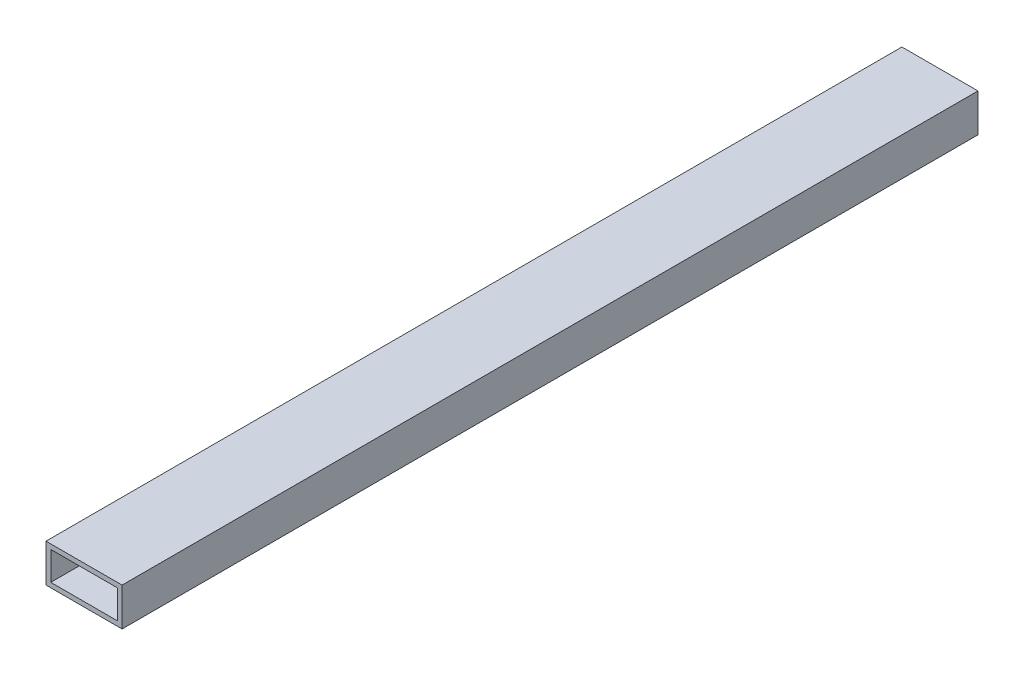
ISO-10303-21;
HEADER;
FILE_DESCRIPTION(('STEP AP214'),'2;1');
FILE_NAME('part.step','',(''),(''),'','','');
FILE_SCHEMA(('AUTOMOTIVE_DESIGN { 1 0 10303 214 1 1 1 1 }'));
ENDSEC;
DATA;
#1=APPLICATION_CONTEXT('core data for automotive mechanical design processes');
#2=APPLICATION_PROTOCOL_DEFINITION('international standard','automotive_design',2000,#1);
#3=PRODUCT_CONTEXT('',#1,'mechanical');
#4=PRODUCT('Part','Part','',(#3));
#5=PRODUCT_RELATED_PRODUCT_CATEGORY('part','',(#4));
#6=PRODUCT_DEFINITION_FORMATION('','',#4);
#7=PRODUCT_DEFINITION_CONTEXT('part definition',#1,'design');
#8=PRODUCT_DEFINITION('design','',#6,#7);
#9=PRODUCT_DEFINITION_SHAPE('','',#8);
#10=(LENGTH_UNIT() NAMED_UNIT(*) SI_UNIT(.MILLI.,.METRE.));
#11=(NAMED_UNIT(*) PLANE_ANGLE_UNIT() SI_UNIT($,.RADIAN.));
#12=(NAMED_UNIT(*) SI_UNIT($,.STERADIAN.) SOLID_ANGLE_UNIT());
#13=UNCERTAINTY_MEASURE_WITH_UNIT(LENGTH_MEASURE(1.E-05),#10,'distance_accuracy_value','');
#14=(GEOMETRIC_REPRESENTATION_CONTEXT(3) GLOBAL_UNCERTAINTY_ASSIGNED_CONTEXT((#13)) GLOBAL_UNIT_ASSIGNED_CONTEXT((#10,
#11,#12)) REPRESENTATION_CONTEXT('',''));
#15=CARTESIAN_POINT('',(0.,0.,0.));
#16=DIRECTION('',(0.,0.,1.));
#17=DIRECTION('',(1.,0.,0.));
#18=AXIS2_PLACEMENT_3D('',#15,#16,#17);
#19=CARTESIAN_POINT('',(0.,0.,225.));
#20=DIRECTION('',(0.,0.,-1.));
#21=DIRECTION('',(-1.,0.,0.));
#22=AXIS2_PLACEMENT_3D('',#19,#20,#21);
#23=PLANE('',#22);
#24=DIRECTION('',(0.,1.,0.));
#25=VECTOR('',#24,1.);
#26=CARTESIAN_POINT('',(20.,-10.,225.));
#27=LINE('',#26,#25);
#28=CARTESIAN_POINT('',(20.,-10.,225.));
#29=VERTEX_POINT('',#28);
#30=CARTESIAN_POINT('',(20.,10.,225.));
#31=VERTEX_POINT('',#30);
#32=EDGE_CURVE('E142',#29,#31,#27,.T.);
#33=ORIENTED_EDGE('',*,*,#32,.T.);
#34=DIRECTION('',(-1.,0.,0.));
#35=VECTOR('',#34,1.);
#36=CARTESIAN_POINT('',(-20.,10.,225.));
#37=LINE('',#36,#35);
#38=CARTESIAN_POINT('',(-20.,10.,225.));
#39=VERTEX_POINT('',#38);
#40=EDGE_CURVE('E145',#31,#39,#37,.T.);
#41=ORIENTED_EDGE('',*,*,#40,.T.);
#42=DIRECTION('',(0.,-1.,0.));
#43=VECTOR('',#42,1.);
#44=CARTESIAN_POINT('',(-20.,-10.,225.));
#45=LINE('',#44,#43);
#46=CARTESIAN_POINT('',(-20.,-10.,225.));
#47=VERTEX_POINT('',#46);
#48=EDGE_CURVE('E148',#39,#47,#45,.T.);
#49=ORIENTED_EDGE('',*,*,#48,.T.);
#50=DIRECTION('',(1.,0.,0.));
#51=VECTOR('',#50,1.);
#52=CARTESIAN_POINT('',(-20.,-10.,225.));
#53=LINE('',#52,#51);
#54=EDGE_CURVE('E150',#47,#29,#53,.T.);
#55=ORIENTED_EDGE('',*,*,#54,.T.);
#56=EDGE_LOOP('',(#33,#41,#49,#55));
#57=FACE_BOUND('',#56,.T.);
#58=DIRECTION('',(1.,0.,0.));
#59=VECTOR('',#58,1.);
#60=CARTESIAN_POINT('',(-17.5,-7.5,225.));
#61=LINE('',#60,#59);
#62=CARTESIAN_POINT('',(-17.5,-7.5,225.));
#63=VERTEX_POINT('',#62);
#64=CARTESIAN_POINT('',(17.5,-7.5,225.));
#65=VERTEX_POINT('',#64);
#66=EDGE_CURVE('E106',#63,#65,#61,.T.);
#67=ORIENTED_EDGE('',*,*,#66,.F.);
#68=DIRECTION('',(0.,-1.,0.));
#69=VECTOR('',#68,1.);
#70=CARTESIAN_POINT('',(-17.5,-7.5,225.));
#71=LINE('',#70,#69);
#72=CARTESIAN_POINT('',(-17.5,7.5,225.));
#73=VERTEX_POINT('',#72);
#74=EDGE_CURVE('E128',#73,#63,#71,.T.);
#75=ORIENTED_EDGE('',*,*,#74,.F.);
#76=DIRECTION('',(-1.,0.,0.));
#77=VECTOR('',#76,1.);
#78=CARTESIAN_POINT('',(-17.5,7.5,225.));
#79=LINE('',#78,#77);
#80=CARTESIAN_POINT('',(17.5,7.5,225.));
#81=VERTEX_POINT('',#80);
#82=EDGE_CURVE('E126',#81,#73,#79,.T.);
#83=ORIENTED_EDGE('',*,*,#82,.F.);
#84=DIRECTION('',(0.,1.,0.));
#85=VECTOR('',#84,1.);
#86=CARTESIAN_POINT('',(17.5,-7.5,225.));
#87=LINE('',#86,#85);
#88=EDGE_CURVE('E114',#65,#81,#87,.T.);
#89=ORIENTED_EDGE('',*,*,#88,.F.);
#90=EDGE_LOOP('',(#67,#75,#83,#89));
#91=FACE_BOUND('',#90,.T.);
#92=ADVANCED_FACE('F41',(#57,#91),#23,.F.);
#93=CARTESIAN_POINT('',(0.,0.,-225.));
#94=DIRECTION('',(0.,0.,-1.));
#95=DIRECTION('',(-1.,0.,0.));
#96=AXIS2_PLACEMENT_3D('',#93,#94,#95);
#97=PLANE('',#96);
#98=DIRECTION('',(0.,1.,0.));
#99=VECTOR('',#98,1.);
#100=CARTESIAN_POINT('',(20.,-10.,-225.));
#101=LINE('',#100,#99);
#102=CARTESIAN_POINT('',(20.,-10.,-225.));
#103=VERTEX_POINT('',#102);
#104=CARTESIAN_POINT('',(20.,10.,-225.));
#105=VERTEX_POINT('',#104);
#106=EDGE_CURVE('E122',#103,#105,#101,.T.);
#107=ORIENTED_EDGE('',*,*,#106,.F.);
#108=DIRECTION('',(1.,0.,0.));
#109=VECTOR('',#108,1.);
#110=CARTESIAN_POINT('',(-20.,-10.,-225.));
#111=LINE('',#110,#109);
#112=CARTESIAN_POINT('',(-20.,-10.,-225.));
#113=VERTEX_POINT('',#112);
#114=EDGE_CURVE('E146',#113,#103,#111,.T.);
#115=ORIENTED_EDGE('',*,*,#114,.F.);
#116=DIRECTION('',(0.,-1.,0.));
#117=VECTOR('',#116,1.);
#118=CARTESIAN_POINT('',(-20.,-10.,-225.));
#119=LINE('',#118,#117);
#120=CARTESIAN_POINT('',(-20.,10.,-225.));
#121=VERTEX_POINT('',#120);
#122=EDGE_CURVE('E157',#121,#113,#119,.T.);
#123=ORIENTED_EDGE('',*,*,#122,.F.);
#124=DIRECTION('',(-1.,0.,0.));
#125=VECTOR('',#124,1.);
#126=CARTESIAN_POINT('',(-20.,10.,-225.));
#127=LINE('',#126,#125);
#128=EDGE_CURVE('E155',#105,#121,#127,.T.);
#129=ORIENTED_EDGE('',*,*,#128,.F.);
#130=EDGE_LOOP('',(#107,#115,#123,#129));
#131=FACE_BOUND('',#130,.T.);
#132=DIRECTION('',(0.,-1.,0.));
#133=VECTOR('',#132,1.);
#134=CARTESIAN_POINT('',(-17.5,-7.5,-225.));
#135=LINE('',#134,#133);
#136=CARTESIAN_POINT('',(-17.5,7.5,-225.));
#137=VERTEX_POINT('',#136);
#138=CARTESIAN_POINT('',(-17.5,-7.5,-225.));
#139=VERTEX_POINT('',#138);
#140=EDGE_CURVE('E115',#137,#139,#135,.T.);
#141=ORIENTED_EDGE('',*,*,#140,.T.);
#142=DIRECTION('',(1.,0.,0.));
#143=VECTOR('',#142,1.);
#144=CARTESIAN_POINT('',(-17.5,-7.5,-225.));
#145=LINE('',#144,#143);
#146=CARTESIAN_POINT('',(17.5,-7.5,-225.));
#147=VERTEX_POINT('',#146);
#148=EDGE_CURVE('E64',#139,#147,#145,.T.);
#149=ORIENTED_EDGE('',*,*,#148,.T.);
#150=DIRECTION('',(0.,1.,0.));
#151=VECTOR('',#150,1.);
#152=CARTESIAN_POINT('',(17.5,-7.5,-225.));
#153=LINE('',#152,#151);
#154=CARTESIAN_POINT('',(17.5,7.5,-225.));
#155=VERTEX_POINT('',#154);
#156=EDGE_CURVE('E121',#147,#155,#153,.T.);
#157=ORIENTED_EDGE('',*,*,#156,.T.);
#158=DIRECTION('',(-1.,0.,0.));
#159=VECTOR('',#158,1.);
#160=CARTESIAN_POINT('',(-17.5,7.5,-225.));
#161=LINE('',#160,#159);
#162=EDGE_CURVE('E134',#155,#137,#161,.T.);
#163=ORIENTED_EDGE('',*,*,#162,.T.);
#164=EDGE_LOOP('',(#141,#149,#157,#163));
#165=FACE_BOUND('',#164,.T.);
#166=ADVANCED_FACE('F175',(#131,#165),#97,.T.);
#167=CARTESIAN_POINT('',(20.,-10.,225.));
#168=DIRECTION('',(-1.,0.,0.));
#169=DIRECTION('',(0.,0.,1.));
#170=AXIS2_PLACEMENT_3D('',#167,#168,#169);
#171=PLANE('',#170);
#172=ORIENTED_EDGE('',*,*,#106,.T.);
#173=DIRECTION('',(0.,0.,-1.));
#174=VECTOR('',#173,1.);
#175=CARTESIAN_POINT('',(20.,10.,225.));
#176=LINE('',#175,#174);
#177=EDGE_CURVE('E11',#31,#105,#176,.T.);
#178=ORIENTED_EDGE('',*,*,#177,.F.);
#179=ORIENTED_EDGE('',*,*,#32,.F.);
#180=DIRECTION('',(0.,0.,-1.));
#181=VECTOR('',#180,1.);
#182=CARTESIAN_POINT('',(20.,-10.,225.));
#183=LINE('',#182,#181);
#184=EDGE_CURVE('E152',#29,#103,#183,.T.);
#185=ORIENTED_EDGE('',*,*,#184,.T.);
#186=EDGE_LOOP('',(#172,#178,#179,#185));
#187=FACE_BOUND('',#186,.T.);
#188=ADVANCED_FACE('F43',(#187),#171,.F.);
#189=CARTESIAN_POINT('',(-20.,10.,225.));
#190=DIRECTION('',(0.,-1.,0.));
#191=DIRECTION('',(0.,0.,-1.));
#192=AXIS2_PLACEMENT_3D('',#189,#190,#191);
#193=PLANE('',#192);
#194=ORIENTED_EDGE('',*,*,#128,.T.);
#195=DIRECTION('',(0.,0.,-1.));
#196=VECTOR('',#195,1.);
#197=CARTESIAN_POINT('',(-20.,10.,225.));
#198=LINE('',#197,#196);
#199=EDGE_CURVE('E49',#39,#121,#198,.T.);
#200=ORIENTED_EDGE('',*,*,#199,.F.);
#201=ORIENTED_EDGE('',*,*,#40,.F.);
#202=ORIENTED_EDGE('',*,*,#177,.T.);
#203=EDGE_LOOP('',(#194,#200,#201,#202));
#204=FACE_BOUND('',#203,.T.);
#205=ADVANCED_FACE('F185',(#204),#193,.F.);
#206=CARTESIAN_POINT('',(-20.,-10.,225.));
#207=DIRECTION('',(1.,0.,0.));
#208=DIRECTION('',(0.,0.,-1.));
#209=AXIS2_PLACEMENT_3D('',#206,#207,#208);
#210=PLANE('',#209);
#211=ORIENTED_EDGE('',*,*,#122,.T.);
#212=DIRECTION('',(0.,0.,-1.));
#213=VECTOR('',#212,1.);
#214=CARTESIAN_POINT('',(-20.,-10.,225.));
#215=LINE('',#214,#213);
#216=EDGE_CURVE('E162',#47,#113,#215,.T.);
#217=ORIENTED_EDGE('',*,*,#216,.F.);
#218=ORIENTED_EDGE('',*,*,#48,.F.);
#219=ORIENTED_EDGE('',*,*,#199,.T.);
#220=EDGE_LOOP('',(#211,#217,#218,#219));
#221=FACE_BOUND('',#220,.T.);
#222=ADVANCED_FACE('F169',(#221),#210,.F.);
#223=CARTESIAN_POINT('',(-20.,-10.,225.));
#224=DIRECTION('',(0.,1.,0.));
#225=DIRECTION('',(0.,0.,1.));
#226=AXIS2_PLACEMENT_3D('',#223,#224,#225);
#227=PLANE('',#226);
#228=ORIENTED_EDGE('',*,*,#114,.T.);
#229=ORIENTED_EDGE('',*,*,#184,.F.);
#230=ORIENTED_EDGE('',*,*,#54,.F.);
#231=ORIENTED_EDGE('',*,*,#216,.T.);
#232=EDGE_LOOP('',(#228,#229,#230,#231));
#233=FACE_BOUND('',#232,.T.);
#234=ADVANCED_FACE('F179',(#233),#227,.F.);
#235=CARTESIAN_POINT('',(-17.5,-7.5,225.));
#236=DIRECTION('',(0.,1.,0.));
#237=DIRECTION('',(0.,0.,1.));
#238=AXIS2_PLACEMENT_3D('',#235,#236,#237);
#239=PLANE('',#238);
#240=ORIENTED_EDGE('',*,*,#148,.F.);
#241=DIRECTION('',(0.,0.,-1.));
#242=VECTOR('',#241,1.);
#243=CARTESIAN_POINT('',(-17.5,-7.5,225.));
#244=LINE('',#243,#242);
#245=EDGE_CURVE('E110',#63,#139,#244,.T.);
#246=ORIENTED_EDGE('',*,*,#245,.F.);
#247=ORIENTED_EDGE('',*,*,#66,.T.);
#248=DIRECTION('',(0.,0.,-1.));
#249=VECTOR('',#248,1.);
#250=CARTESIAN_POINT('',(17.5,-7.5,225.));
#251=LINE('',#250,#249);
#252=EDGE_CURVE('E109',#65,#147,#251,.T.);
#253=ORIENTED_EDGE('',*,*,#252,.T.);
#254=EDGE_LOOP('',(#240,#246,#247,#253));
#255=FACE_BOUND('',#254,.T.);
#256=ADVANCED_FACE('F108',(#255),#239,.T.);
#257=CARTESIAN_POINT('',(17.5,-7.5,225.));
#258=DIRECTION('',(-1.,0.,0.));
#259=DIRECTION('',(0.,0.,1.));
#260=AXIS2_PLACEMENT_3D('',#257,#258,#259);
#261=PLANE('',#260);
#262=ORIENTED_EDGE('',*,*,#156,.F.);
#263=ORIENTED_EDGE('',*,*,#252,.F.);
#264=ORIENTED_EDGE('',*,*,#88,.T.);
#265=DIRECTION('',(0.,0.,-1.));
#266=VECTOR('',#265,1.);
#267=CARTESIAN_POINT('',(17.5,7.5,225.));
#268=LINE('',#267,#266);
#269=EDGE_CURVE('E123',#81,#155,#268,.T.);
#270=ORIENTED_EDGE('',*,*,#269,.T.);
#271=EDGE_LOOP('',(#262,#263,#264,#270));
#272=FACE_BOUND('',#271,.T.);
#273=ADVANCED_FACE('F118',(#272),#261,.T.);
#274=CARTESIAN_POINT('',(-17.5,7.5,225.));
#275=DIRECTION('',(0.,-1.,0.));
#276=DIRECTION('',(0.,0.,-1.));
#277=AXIS2_PLACEMENT_3D('',#274,#275,#276);
#278=PLANE('',#277);
#279=ORIENTED_EDGE('',*,*,#162,.F.);
#280=ORIENTED_EDGE('',*,*,#269,.F.);
#281=ORIENTED_EDGE('',*,*,#82,.T.);
#282=DIRECTION('',(0.,0.,-1.));
#283=VECTOR('',#282,1.);
#284=CARTESIAN_POINT('',(-17.5,7.5,225.));
#285=LINE('',#284,#283);
#286=EDGE_CURVE('E56',#73,#137,#285,.T.);
#287=ORIENTED_EDGE('',*,*,#286,.T.);
#288=EDGE_LOOP('',(#279,#280,#281,#287));
#289=FACE_BOUND('',#288,.T.);
#290=ADVANCED_FACE('F208',(#289),#278,.T.);
#291=CARTESIAN_POINT('',(-17.5,-7.5,225.));
#292=DIRECTION('',(1.,0.,0.));
#293=DIRECTION('',(0.,0.,-1.));
#294=AXIS2_PLACEMENT_3D('',#291,#292,#293);
#295=PLANE('',#294);
#296=ORIENTED_EDGE('',*,*,#140,.F.);
#297=ORIENTED_EDGE('',*,*,#286,.F.);
#298=ORIENTED_EDGE('',*,*,#74,.T.);
#299=ORIENTED_EDGE('',*,*,#245,.T.);
#300=EDGE_LOOP('',(#296,#297,#298,#299));
#301=FACE_BOUND('',#300,.T.);
#302=ADVANCED_FACE('F212',(#301),#295,.T.);
#303=CLOSED_SHELL('',(#92,#166,#188,#205,#222,#234,#256,#273,#290,#302));
#304=MANIFOLD_SOLID_BREP('B2',#303);
#305=ADVANCED_BREP_SHAPE_REPRESENTATION('',(#18,#304),#14);
#306=SHAPE_DEFINITION_REPRESENTATION(#9,#305);
ENDSEC;
END-ISO-10303-21;
